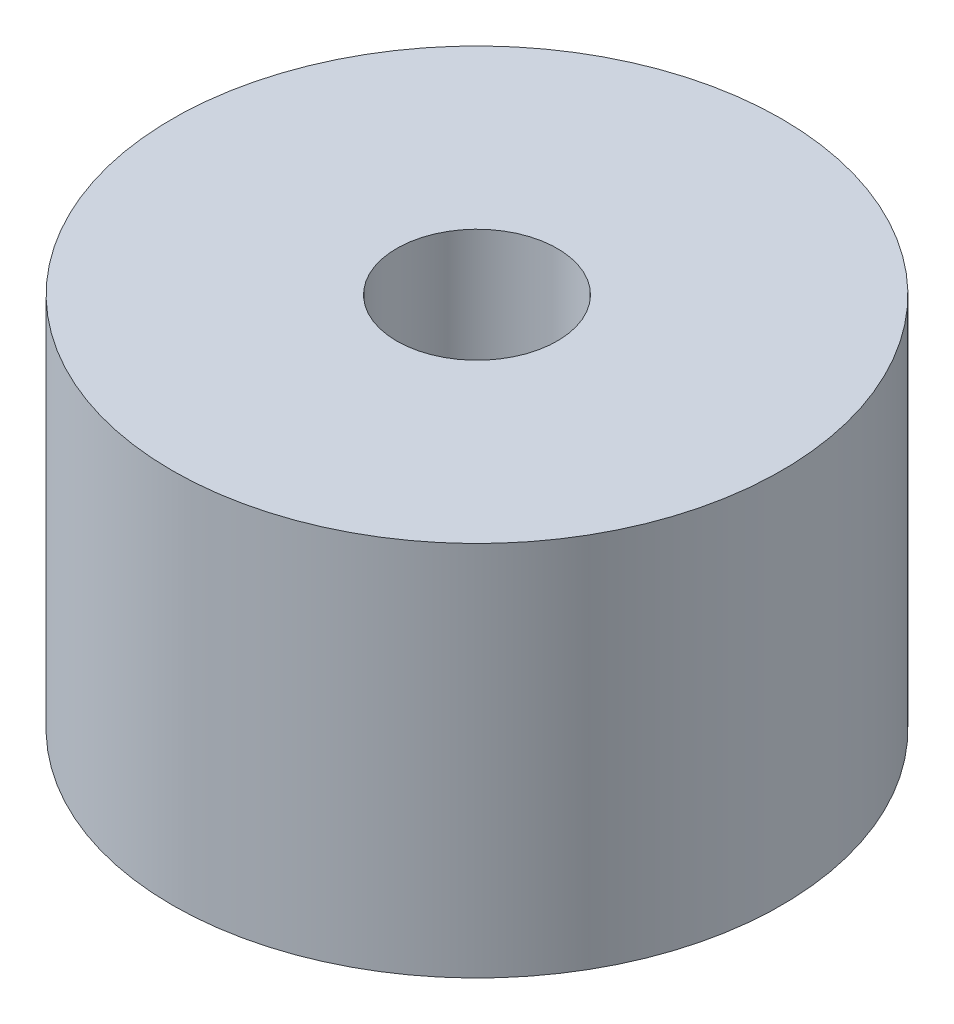
ISO-10303-21;
HEADER;
FILE_DESCRIPTION(('STEP AP214'),'2;1');
FILE_NAME('part.step','',(''),(''),'','','');
FILE_SCHEMA(('AUTOMOTIVE_DESIGN { 1 0 10303 214 1 1 1 1 }'));
ENDSEC;
DATA;
#1=APPLICATION_CONTEXT('core data for automotive mechanical design processes');
#2=APPLICATION_PROTOCOL_DEFINITION('international standard','automotive_design',2000,#1);
#3=PRODUCT_CONTEXT('',#1,'mechanical');
#4=PRODUCT('Part','Part','',(#3));
#5=PRODUCT_RELATED_PRODUCT_CATEGORY('part','',(#4));
#6=PRODUCT_DEFINITION_FORMATION('','',#4);
#7=PRODUCT_DEFINITION_CONTEXT('part definition',#1,'design');
#8=PRODUCT_DEFINITION('design','',#6,#7);
#9=PRODUCT_DEFINITION_SHAPE('','',#8);
#10=(LENGTH_UNIT() NAMED_UNIT(*) SI_UNIT(.MILLI.,.METRE.));
#11=(NAMED_UNIT(*) PLANE_ANGLE_UNIT() SI_UNIT($,.RADIAN.));
#12=(NAMED_UNIT(*) SI_UNIT($,.STERADIAN.) SOLID_ANGLE_UNIT());
#13=UNCERTAINTY_MEASURE_WITH_UNIT(LENGTH_MEASURE(1.E-05),#10,'distance_accuracy_value','');
#14=(GEOMETRIC_REPRESENTATION_CONTEXT(3) GLOBAL_UNCERTAINTY_ASSIGNED_CONTEXT((#13)) GLOBAL_UNIT_ASSIGNED_CONTEXT((#10,
#11,#12)) REPRESENTATION_CONTEXT('',''));
#15=CARTESIAN_POINT('',(0.,0.,0.));
#16=DIRECTION('',(0.,0.,1.));
#17=DIRECTION('',(1.,0.,0.));
#18=AXIS2_PLACEMENT_3D('',#15,#16,#17);
#19=CARTESIAN_POINT('',(0.,10.9,0.));
#20=DIRECTION('',(0.,1.,0.));
#21=DIRECTION('',(0.,0.,1.));
#22=AXIS2_PLACEMENT_3D('',#19,#20,#21);
#23=PLANE('',#22);
#24=CARTESIAN_POINT('',(0.,10.9,0.));
#25=DIRECTION('',(0.,1.,0.));
#26=DIRECTION('',(0.,0.,1.));
#27=AXIS2_PLACEMENT_3D('',#24,#25,#26);
#28=CIRCLE('',#27,8.825);
#29=CARTESIAN_POINT('',(0.,10.9,8.825));
#30=VERTEX_POINT('',#29);
#31=EDGE_CURVE('E10',#30,#30,#28,.T.);
#32=ORIENTED_EDGE('',*,*,#31,.T.);
#33=EDGE_LOOP('',(#32));
#34=FACE_BOUND('',#33,.T.);
#35=CARTESIAN_POINT('',(0.,10.9,0.));
#36=DIRECTION('',(0.,1.,0.));
#37=DIRECTION('',(0.,0.,1.));
#38=AXIS2_PLACEMENT_3D('',#35,#36,#37);
#39=CIRCLE('',#38,2.325);
#40=CARTESIAN_POINT('',(0.,10.9,2.325));
#41=VERTEX_POINT('',#40);
#42=EDGE_CURVE('E42',#41,#41,#39,.T.);
#43=ORIENTED_EDGE('',*,*,#42,.F.);
#44=EDGE_LOOP('',(#43));
#45=FACE_BOUND('',#44,.T.);
#46=ADVANCED_FACE('F31',(#34,#45),#23,.T.);
#47=CARTESIAN_POINT('',(0.,0.,0.));
#48=DIRECTION('',(0.,1.,0.));
#49=DIRECTION('',(0.,0.,1.));
#50=AXIS2_PLACEMENT_3D('',#47,#48,#49);
#51=PLANE('',#50);
#52=CARTESIAN_POINT('',(0.,0.,0.));
#53=DIRECTION('',(0.,1.,0.));
#54=DIRECTION('',(0.,0.,1.));
#55=AXIS2_PLACEMENT_3D('',#52,#53,#54);
#56=CIRCLE('',#55,8.825);
#57=CARTESIAN_POINT('',(0.,0.,8.825));
#58=VERTEX_POINT('',#57);
#59=EDGE_CURVE('E35',#58,#58,#56,.T.);
#60=ORIENTED_EDGE('',*,*,#59,.F.);
#61=EDGE_LOOP('',(#60));
#62=FACE_BOUND('',#61,.T.);
#63=CARTESIAN_POINT('',(0.,0.,0.));
#64=DIRECTION('',(0.,1.,0.));
#65=DIRECTION('',(0.,0.,1.));
#66=AXIS2_PLACEMENT_3D('',#63,#64,#65);
#67=CIRCLE('',#66,2.325);
#68=CARTESIAN_POINT('',(0.,0.,2.325));
#69=VERTEX_POINT('',#68);
#70=EDGE_CURVE('E44',#69,#69,#67,.T.);
#71=ORIENTED_EDGE('',*,*,#70,.T.);
#72=EDGE_LOOP('',(#71));
#73=FACE_BOUND('',#72,.T.);
#74=ADVANCED_FACE('F54',(#62,#73),#51,.F.);
#75=CARTESIAN_POINT('',(0.,10.9,0.));
#76=DIRECTION('',(0.,-1.,0.));
#77=DIRECTION('',(0.,0.,-1.));
#78=AXIS2_PLACEMENT_3D('',#75,#76,#77);
#79=CYLINDRICAL_SURFACE('',#78,8.825);
#80=ORIENTED_EDGE('',*,*,#31,.F.);
#81=EDGE_LOOP('',(#80));
#82=FACE_BOUND('',#81,.T.);
#83=ORIENTED_EDGE('',*,*,#59,.T.);
#84=EDGE_LOOP('',(#83));
#85=FACE_BOUND('',#84,.T.);
#86=ADVANCED_FACE('F33',(#82,#85),#79,.T.);
#87=CARTESIAN_POINT('',(0.,10.9,0.));
#88=DIRECTION('',(0.,-1.,0.));
#89=DIRECTION('',(0.,0.,-1.));
#90=AXIS2_PLACEMENT_3D('',#87,#88,#89);
#91=CYLINDRICAL_SURFACE('',#90,2.325);
#92=ORIENTED_EDGE('',*,*,#42,.T.);
#93=EDGE_LOOP('',(#92));
#94=FACE_BOUND('',#93,.T.);
#95=ORIENTED_EDGE('',*,*,#70,.F.);
#96=EDGE_LOOP('',(#95));
#97=FACE_BOUND('',#96,.T.);
#98=ADVANCED_FACE('F50',(#94,#97),#91,.F.);
#99=CLOSED_SHELL('',(#46,#74,#86,#98));
#100=MANIFOLD_SOLID_BREP('B2',#99);
#101=ADVANCED_BREP_SHAPE_REPRESENTATION('',(#18,#100),#14);
#102=SHAPE_DEFINITION_REPRESENTATION(#9,#101);
ENDSEC;
END-ISO-10303-21;
